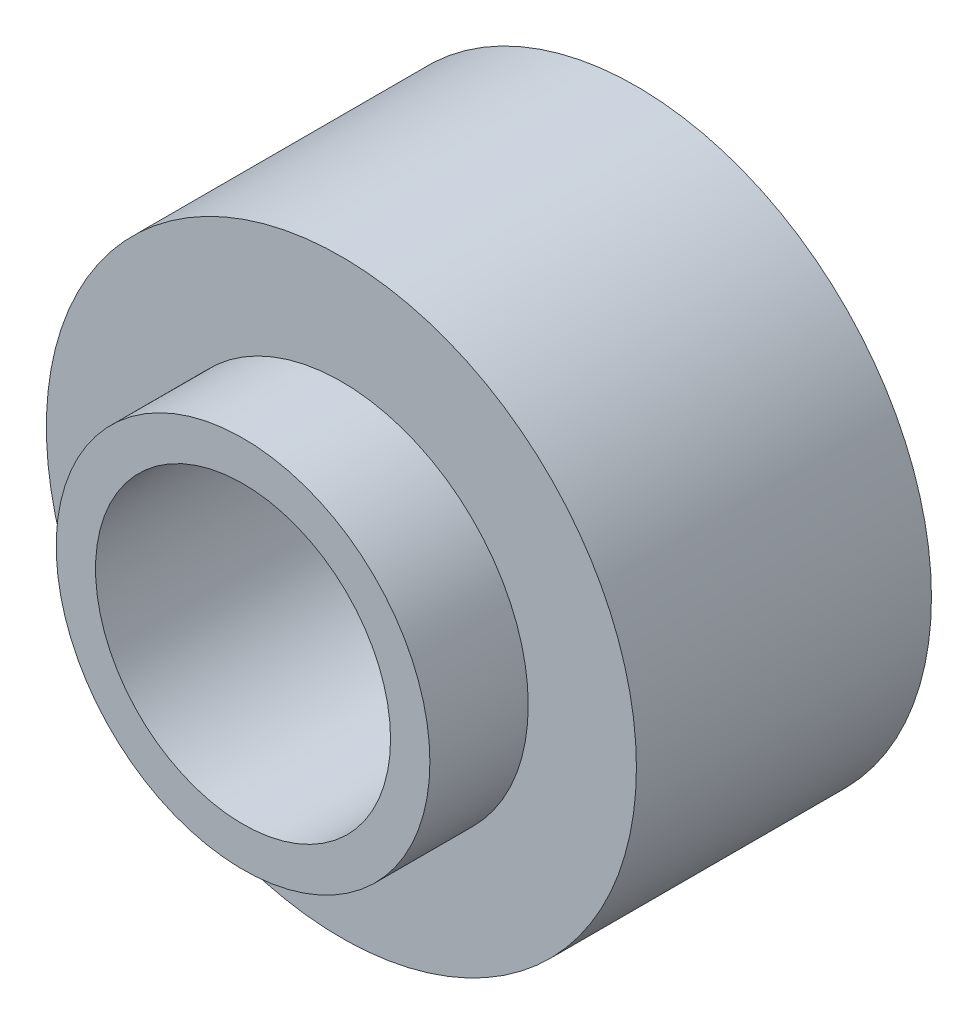
ISO-10303-21;
HEADER;
FILE_DESCRIPTION(('STEP AP214'),'2;1');
FILE_NAME('part.step','',(''),(''),'','','');
FILE_SCHEMA(('AUTOMOTIVE_DESIGN { 1 0 10303 214 1 1 1 1 }'));
ENDSEC;
DATA;
#1=APPLICATION_CONTEXT('core data for automotive mechanical design processes');
#2=APPLICATION_PROTOCOL_DEFINITION('international standard','automotive_design',2000,#1);
#3=PRODUCT_CONTEXT('',#1,'mechanical');
#4=PRODUCT('Part','Part','',(#3));
#5=PRODUCT_RELATED_PRODUCT_CATEGORY('part','',(#4));
#6=PRODUCT_DEFINITION_FORMATION('','',#4);
#7=PRODUCT_DEFINITION_CONTEXT('part definition',#1,'design');
#8=PRODUCT_DEFINITION('design','',#6,#7);
#9=PRODUCT_DEFINITION_SHAPE('','',#8);
#10=(LENGTH_UNIT() NAMED_UNIT(*) SI_UNIT(.MILLI.,.METRE.));
#11=(NAMED_UNIT(*) PLANE_ANGLE_UNIT() SI_UNIT($,.RADIAN.));
#12=(NAMED_UNIT(*) SI_UNIT($,.STERADIAN.) SOLID_ANGLE_UNIT());
#13=UNCERTAINTY_MEASURE_WITH_UNIT(LENGTH_MEASURE(1.E-05),#10,'distance_accuracy_value','');
#14=(GEOMETRIC_REPRESENTATION_CONTEXT(3) GLOBAL_UNCERTAINTY_ASSIGNED_CONTEXT((#13)) GLOBAL_UNIT_ASSIGNED_CONTEXT((#10,
#11,#12)) REPRESENTATION_CONTEXT('',''));
#15=CARTESIAN_POINT('',(0.,0.,0.));
#16=DIRECTION('',(0.,0.,1.));
#17=DIRECTION('',(1.,0.,0.));
#18=AXIS2_PLACEMENT_3D('',#15,#16,#17);
#19=CARTESIAN_POINT('',(0.,0.,0.5));
#20=DIRECTION('',(0.,0.,1.));
#21=DIRECTION('',(1.,0.,0.));
#22=AXIS2_PLACEMENT_3D('',#19,#20,#21);
#23=PLANE('',#22);
#24=CARTESIAN_POINT('',(0.,0.,0.5));
#25=DIRECTION('',(0.,0.,1.));
#26=DIRECTION('',(1.,0.,0.));
#27=AXIS2_PLACEMENT_3D('',#24,#25,#26);
#28=CIRCLE('',#27,0.1875);
#29=CARTESIAN_POINT('',(0.1875,0.,0.5));
#30=VERTEX_POINT('',#29);
#31=EDGE_CURVE('E45',#30,#30,#28,.T.);
#32=ORIENTED_EDGE('',*,*,#31,.F.);
#33=EDGE_LOOP('',(#32));
#34=FACE_BOUND('',#33,.T.);
#35=CARTESIAN_POINT('',(0.,0.,0.5));
#36=DIRECTION('',(0.,0.,1.));
#37=DIRECTION('',(1.,0.,0.));
#38=AXIS2_PLACEMENT_3D('',#35,#36,#37);
#39=CIRCLE('',#38,0.2375);
#40=CARTESIAN_POINT('',(0.2375,0.,0.5));
#41=VERTEX_POINT('',#40);
#42=EDGE_CURVE('E62',#41,#41,#39,.T.);
#43=ORIENTED_EDGE('',*,*,#42,.T.);
#44=EDGE_LOOP('',(#43));
#45=FACE_BOUND('',#44,.T.);
#46=ADVANCED_FACE('F37',(#34,#45),#23,.T.);
#47=CARTESIAN_POINT('',(0.,0.,0.5));
#48=DIRECTION('',(0.,0.,-1.));
#49=DIRECTION('',(-1.,0.,0.));
#50=AXIS2_PLACEMENT_3D('',#47,#48,#49);
#51=CYLINDRICAL_SURFACE('',#50,0.375);
#52=CARTESIAN_POINT('',(0.,0.,0.));
#53=DIRECTION('',(0.,0.,1.));
#54=DIRECTION('',(1.,0.,0.));
#55=AXIS2_PLACEMENT_3D('',#52,#53,#54);
#56=CIRCLE('',#55,0.375);
#57=CARTESIAN_POINT('',(0.375,0.,0.));
#58=VERTEX_POINT('',#57);
#59=EDGE_CURVE('E10',#58,#58,#56,.T.);
#60=ORIENTED_EDGE('',*,*,#59,.T.);
#61=EDGE_LOOP('',(#60));
#62=FACE_BOUND('',#61,.T.);
#63=CARTESIAN_POINT('',(0.,0.,0.375));
#64=DIRECTION('',(0.,0.,1.));
#65=DIRECTION('',(1.,0.,0.));
#66=AXIS2_PLACEMENT_3D('',#63,#64,#65);
#67=CIRCLE('',#66,0.375);
#68=CARTESIAN_POINT('',(0.375,0.,0.375));
#69=VERTEX_POINT('',#68);
#70=EDGE_CURVE('E56',#69,#69,#67,.T.);
#71=ORIENTED_EDGE('',*,*,#70,.F.);
#72=EDGE_LOOP('',(#71));
#73=FACE_BOUND('',#72,.T.);
#74=ADVANCED_FACE('F39',(#62,#73),#51,.T.);
#75=CARTESIAN_POINT('',(0.,0.,0.));
#76=DIRECTION('',(0.,0.,1.));
#77=DIRECTION('',(1.,0.,0.));
#78=AXIS2_PLACEMENT_3D('',#75,#76,#77);
#79=PLANE('',#78);
#80=ORIENTED_EDGE('',*,*,#59,.F.);
#81=EDGE_LOOP('',(#80));
#82=FACE_BOUND('',#81,.T.);
#83=CARTESIAN_POINT('',(0.,0.,0.));
#84=DIRECTION('',(0.,0.,1.));
#85=DIRECTION('',(1.,0.,0.));
#86=AXIS2_PLACEMENT_3D('',#83,#84,#85);
#87=CIRCLE('',#86,0.1875);
#88=CARTESIAN_POINT('',(0.1875,0.,0.));
#89=VERTEX_POINT('',#88);
#90=EDGE_CURVE('E50',#89,#89,#87,.T.);
#91=ORIENTED_EDGE('',*,*,#90,.T.);
#92=EDGE_LOOP('',(#91));
#93=FACE_BOUND('',#92,.T.);
#94=ADVANCED_FACE('F81',(#82,#93),#79,.F.);
#95=CARTESIAN_POINT('',(0.,0.,0.5));
#96=DIRECTION('',(0.,0.,-1.));
#97=DIRECTION('',(-1.,0.,0.));
#98=AXIS2_PLACEMENT_3D('',#95,#96,#97);
#99=CYLINDRICAL_SURFACE('',#98,0.1875);
#100=ORIENTED_EDGE('',*,*,#31,.T.);
#101=EDGE_LOOP('',(#100));
#102=FACE_BOUND('',#101,.T.);
#103=ORIENTED_EDGE('',*,*,#90,.F.);
#104=EDGE_LOOP('',(#103));
#105=FACE_BOUND('',#104,.T.);
#106=ADVANCED_FACE('F76',(#102,#105),#99,.F.);
#107=CARTESIAN_POINT('',(0.,0.,0.375));
#108=DIRECTION('',(0.,0.,1.));
#109=DIRECTION('',(1.,0.,0.));
#110=AXIS2_PLACEMENT_3D('',#107,#108,#109);
#111=PLANE('',#110);
#112=CARTESIAN_POINT('',(0.,0.,0.375));
#113=DIRECTION('',(0.,0.,1.));
#114=DIRECTION('',(1.,0.,0.));
#115=AXIS2_PLACEMENT_3D('',#112,#113,#114);
#116=CIRCLE('',#115,0.2375);
#117=CARTESIAN_POINT('',(0.2375,0.,0.375));
#118=VERTEX_POINT('',#117);
#119=EDGE_CURVE('E61',#118,#118,#116,.T.);
#120=ORIENTED_EDGE('',*,*,#119,.F.);
#121=EDGE_LOOP('',(#120));
#122=FACE_BOUND('',#121,.T.);
#123=ORIENTED_EDGE('',*,*,#70,.T.);
#124=EDGE_LOOP('',(#123));
#125=FACE_BOUND('',#124,.T.);
#126=ADVANCED_FACE('F73',(#122,#125),#111,.T.);
#127=CARTESIAN_POINT('',(0.,0.,0.375));
#128=DIRECTION('',(0.,0.,1.));
#129=DIRECTION('',(1.,0.,0.));
#130=AXIS2_PLACEMENT_3D('',#127,#128,#129);
#131=CYLINDRICAL_SURFACE('',#130,0.2375);
#132=ORIENTED_EDGE('',*,*,#119,.T.);
#133=EDGE_LOOP('',(#132));
#134=FACE_BOUND('',#133,.T.);
#135=ORIENTED_EDGE('',*,*,#42,.F.);
#136=EDGE_LOOP('',(#135));
#137=FACE_BOUND('',#136,.T.);
#138=ADVANCED_FACE('F70',(#134,#137),#131,.T.);
#139=CLOSED_SHELL('',(#46,#74,#94,#106,#126,#138));
#140=MANIFOLD_SOLID_BREP('B2',#139);
#141=ADVANCED_BREP_SHAPE_REPRESENTATION('',(#18,#140),#14);
#142=SHAPE_DEFINITION_REPRESENTATION(#9,#141);
ENDSEC;
END-ISO-10303-21;
